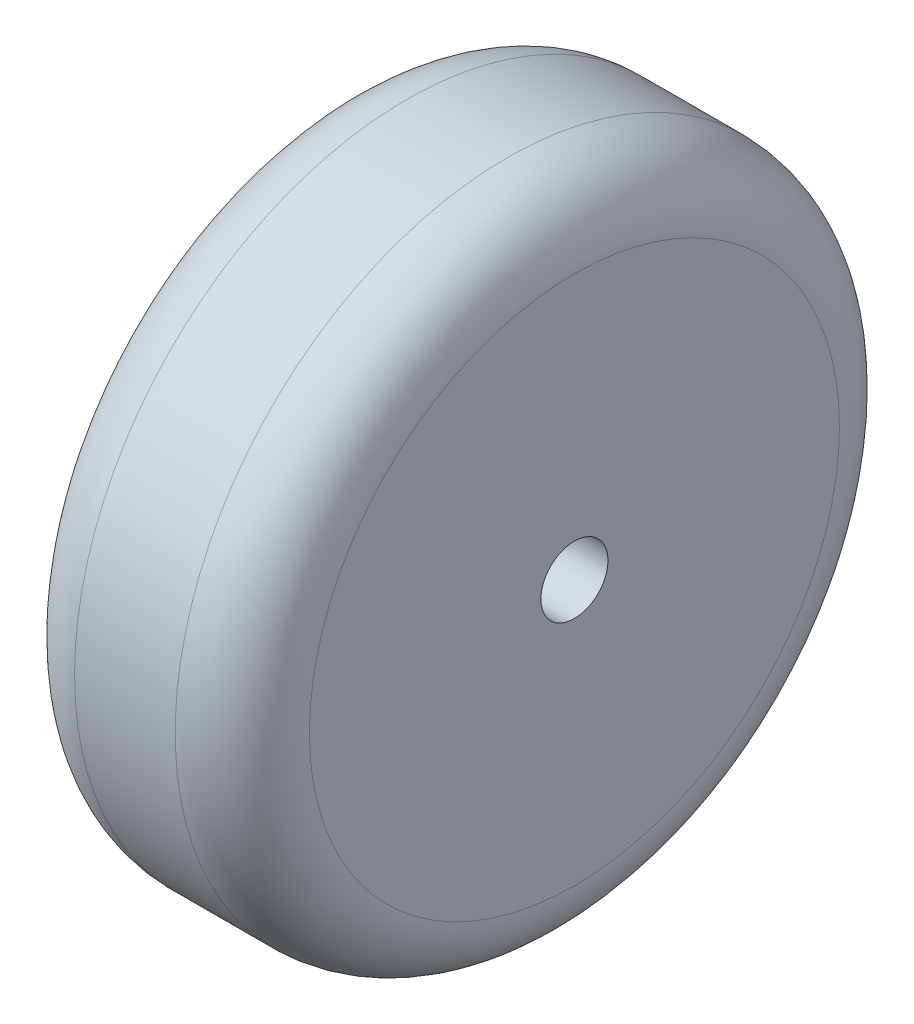
ISO-10303-21;
HEADER;
FILE_DESCRIPTION(('STEP AP214'),'2;1');
FILE_NAME('part.step','',(''),(''),'','','');
FILE_SCHEMA(('AUTOMOTIVE_DESIGN { 1 0 10303 214 1 1 1 1 }'));
ENDSEC;
DATA;
#1=APPLICATION_CONTEXT('core data for automotive mechanical design processes');
#2=APPLICATION_PROTOCOL_DEFINITION('international standard','automotive_design',2000,#1);
#3=PRODUCT_CONTEXT('',#1,'mechanical');
#4=PRODUCT('Part','Part','',(#3));
#5=PRODUCT_RELATED_PRODUCT_CATEGORY('part','',(#4));
#6=PRODUCT_DEFINITION_FORMATION('','',#4);
#7=PRODUCT_DEFINITION_CONTEXT('part definition',#1,'design');
#8=PRODUCT_DEFINITION('design','',#6,#7);
#9=PRODUCT_DEFINITION_SHAPE('','',#8);
#10=(LENGTH_UNIT() NAMED_UNIT(*) SI_UNIT(.MILLI.,.METRE.));
#11=(NAMED_UNIT(*) PLANE_ANGLE_UNIT() SI_UNIT($,.RADIAN.));
#12=(NAMED_UNIT(*) SI_UNIT($,.STERADIAN.) SOLID_ANGLE_UNIT());
#13=UNCERTAINTY_MEASURE_WITH_UNIT(LENGTH_MEASURE(1.E-05),#10,'distance_accuracy_value','');
#14=(GEOMETRIC_REPRESENTATION_CONTEXT(3) GLOBAL_UNCERTAINTY_ASSIGNED_CONTEXT((#13)) GLOBAL_UNIT_ASSIGNED_CONTEXT((#10,
#11,#12)) REPRESENTATION_CONTEXT('',''));
#15=CARTESIAN_POINT('',(0.,0.,0.));
#16=DIRECTION('',(0.,0.,1.));
#17=DIRECTION('',(1.,0.,0.));
#18=AXIS2_PLACEMENT_3D('',#15,#16,#17);
#19=CARTESIAN_POINT('',(-35.,56.75,0.));
#20=DIRECTION('',(-1.,0.,0.));
#21=DIRECTION('',(0.,0.,1.));
#22=AXIS2_PLACEMENT_3D('',#19,#20,#21);
#23=PLANE('',#22);
#24=CARTESIAN_POINT('',(-35.,0.,0.));
#25=DIRECTION('',(-1.,0.,0.));
#26=DIRECTION('',(0.,0.,1.));
#27=AXIS2_PLACEMENT_3D('',#24,#25,#26);
#28=CIRCLE('',#27,79.);
#29=CARTESIAN_POINT('',(-35.,0.,79.));
#30=VERTEX_POINT('',#29);
#31=EDGE_CURVE('E11',#30,#30,#28,.T.);
#32=ORIENTED_EDGE('',*,*,#31,.T.);
#33=EDGE_LOOP('',(#32));
#34=FACE_BOUND('',#33,.T.);
#35=DIRECTION('',(0.,0.,-1.));
#36=VECTOR('',#35,1.);
#37=CARTESIAN_POINT('',(-35.,66.5293065586338,-5.));
#38=LINE('',#37,#36);
#39=CARTESIAN_POINT('',(-35.,66.5293065586338,5.));
#40=VERTEX_POINT('',#39);
#41=CARTESIAN_POINT('',(-35.,66.5293065586338,-5.));
#42=VERTEX_POINT('',#41);
#43=EDGE_CURVE('E102',#40,#42,#38,.T.);
#44=ORIENTED_EDGE('',*,*,#43,.F.);
#45=DIRECTION('',(0.,1.,0.));
#46=VECTOR('',#45,1.);
#47=CARTESIAN_POINT('',(-35.,66.5293065586338,5.));
#48=LINE('',#47,#46);
#49=CARTESIAN_POINT('',(-35.,56.5293065586338,5.));
#50=VERTEX_POINT('',#49);
#51=EDGE_CURVE('E90',#50,#40,#48,.T.);
#52=ORIENTED_EDGE('',*,*,#51,.F.);
#53=CARTESIAN_POINT('',(-35.,0.,0.));
#54=DIRECTION('',(1.,0.,0.));
#55=DIRECTION('',(0.,0.,-1.));
#56=AXIS2_PLACEMENT_3D('',#53,#54,#55);
#57=CIRCLE('',#56,56.75);
#58=CARTESIAN_POINT('',(-35.,56.5293065586338,-5.));
#59=VERTEX_POINT('',#58);
#60=EDGE_CURVE('E111',#50,#59,#57,.T.);
#61=ORIENTED_EDGE('',*,*,#60,.T.);
#62=DIRECTION('',(0.,-1.,0.));
#63=VECTOR('',#62,1.);
#64=CARTESIAN_POINT('',(-35.,66.5293065586338,-5.));
#65=LINE('',#64,#63);
#66=EDGE_CURVE('E71',#42,#59,#65,.T.);
#67=ORIENTED_EDGE('',*,*,#66,.F.);
#68=EDGE_LOOP('',(#44,#52,#61,#67));
#69=FACE_BOUND('',#68,.T.);
#70=ADVANCED_FACE('F34',(#34,#69),#23,.T.);
#71=CARTESIAN_POINT('',(45.,0.,0.));
#72=DIRECTION('',(1.,0.,0.));
#73=DIRECTION('',(0.,0.,-1.));
#74=AXIS2_PLACEMENT_3D('',#71,#72,#73);
#75=CYLINDRICAL_SURFACE('',#74,9.99999999999999);
#76=CARTESIAN_POINT('',(35.,0.,0.));
#77=DIRECTION('',(1.,0.,0.));
#78=DIRECTION('',(0.,0.,-1.));
#79=AXIS2_PLACEMENT_3D('',#76,#77,#78);
#80=CIRCLE('',#79,9.99999999999999);
#81=CARTESIAN_POINT('',(35.,0.,-9.99999999999999));
#82=VERTEX_POINT('',#81);
#83=EDGE_CURVE('E108',#82,#82,#80,.T.);
#84=ORIENTED_EDGE('',*,*,#83,.T.);
#85=EDGE_LOOP('',(#84));
#86=FACE_BOUND('',#85,.T.);
#87=CARTESIAN_POINT('',(15.51,0.,0.));
#88=DIRECTION('',(1.,0.,0.));
#89=DIRECTION('',(0.,0.,-1.));
#90=AXIS2_PLACEMENT_3D('',#87,#88,#89);
#91=CIRCLE('',#90,10.);
#92=CARTESIAN_POINT('',(15.51,0.,-10.));
#93=VERTEX_POINT('',#92);
#94=EDGE_CURVE('E129',#93,#93,#91,.T.);
#95=ORIENTED_EDGE('',*,*,#94,.F.);
#96=EDGE_LOOP('',(#95));
#97=FACE_BOUND('',#96,.T.);
#98=ADVANCED_FACE('F154',(#86,#97),#75,.F.);
#99=CARTESIAN_POINT('',(15.51,10.,0.));
#100=DIRECTION('',(-1.,0.,0.));
#101=DIRECTION('',(0.,0.,1.));
#102=AXIS2_PLACEMENT_3D('',#99,#100,#101);
#103=PLANE('',#102);
#104=ORIENTED_EDGE('',*,*,#94,.T.);
#105=EDGE_LOOP('',(#104));
#106=FACE_BOUND('',#105,.T.);
#107=CARTESIAN_POINT('',(15.51,0.,0.));
#108=DIRECTION('',(1.,0.,0.));
#109=DIRECTION('',(0.,0.,-1.));
#110=AXIS2_PLACEMENT_3D('',#107,#108,#109);
#111=CIRCLE('',#110,17.5);
#112=CARTESIAN_POINT('',(15.51,0.,-17.5));
#113=VERTEX_POINT('',#112);
#114=EDGE_CURVE('E126',#113,#113,#111,.T.);
#115=ORIENTED_EDGE('',*,*,#114,.F.);
#116=EDGE_LOOP('',(#115));
#117=FACE_BOUND('',#116,.T.);
#118=ADVANCED_FACE('F157',(#106,#117),#103,.T.);
#119=CARTESIAN_POINT('',(45.,0.,0.));
#120=DIRECTION('',(1.,0.,0.));
#121=DIRECTION('',(0.,0.,-1.));
#122=AXIS2_PLACEMENT_3D('',#119,#120,#121);
#123=CYLINDRICAL_SURFACE('',#122,17.5);
#124=ORIENTED_EDGE('',*,*,#114,.T.);
#125=EDGE_LOOP('',(#124));
#126=FACE_BOUND('',#125,.T.);
#127=CARTESIAN_POINT('',(4.51000000000002,0.,0.));
#128=DIRECTION('',(1.,0.,0.));
#129=DIRECTION('',(0.,0.,-1.));
#130=AXIS2_PLACEMENT_3D('',#127,#128,#129);
#131=CIRCLE('',#130,17.5);
#132=CARTESIAN_POINT('',(4.51000000000002,0.,-17.5));
#133=VERTEX_POINT('',#132);
#134=EDGE_CURVE('E123',#133,#133,#131,.T.);
#135=ORIENTED_EDGE('',*,*,#134,.F.);
#136=EDGE_LOOP('',(#135));
#137=FACE_BOUND('',#136,.T.);
#138=ADVANCED_FACE('F163',(#126,#137),#123,.F.);
#139=CARTESIAN_POINT('',(4.51000000000002,17.5,0.));
#140=DIRECTION('',(-1.,0.,0.));
#141=DIRECTION('',(0.,0.,1.));
#142=AXIS2_PLACEMENT_3D('',#139,#140,#141);
#143=PLANE('',#142);
#144=ORIENTED_EDGE('',*,*,#134,.T.);
#145=EDGE_LOOP('',(#144));
#146=FACE_BOUND('',#145,.T.);
#147=CARTESIAN_POINT('',(4.51000000000002,0.,0.));
#148=DIRECTION('',(1.,0.,0.));
#149=DIRECTION('',(0.,0.,-1.));
#150=AXIS2_PLACEMENT_3D('',#147,#148,#149);
#151=CIRCLE('',#150,32.5);
#152=CARTESIAN_POINT('',(4.51000000000002,0.,-32.5));
#153=VERTEX_POINT('',#152);
#154=EDGE_CURVE('E120',#153,#153,#151,.T.);
#155=ORIENTED_EDGE('',*,*,#154,.F.);
#156=EDGE_LOOP('',(#155));
#157=FACE_BOUND('',#156,.T.);
#158=ADVANCED_FACE('F169',(#146,#157),#143,.T.);
#159=CARTESIAN_POINT('',(45.,0.,0.));
#160=DIRECTION('',(1.,0.,0.));
#161=DIRECTION('',(0.,0.,-1.));
#162=AXIS2_PLACEMENT_3D('',#159,#160,#161);
#163=CYLINDRICAL_SURFACE('',#162,32.5);
#164=ORIENTED_EDGE('',*,*,#154,.T.);
#165=EDGE_LOOP('',(#164));
#166=FACE_BOUND('',#165,.T.);
#167=CARTESIAN_POINT('',(-28.39,0.,0.));
#168=DIRECTION('',(1.,0.,0.));
#169=DIRECTION('',(0.,0.,-1.));
#170=AXIS2_PLACEMENT_3D('',#167,#168,#169);
#171=CIRCLE('',#170,32.5);
#172=CARTESIAN_POINT('',(-28.39,0.,-32.5));
#173=VERTEX_POINT('',#172);
#174=EDGE_CURVE('E117',#173,#173,#171,.T.);
#175=ORIENTED_EDGE('',*,*,#174,.F.);
#176=EDGE_LOOP('',(#175));
#177=FACE_BOUND('',#176,.T.);
#178=ADVANCED_FACE('F175',(#166,#177),#163,.F.);
#179=CARTESIAN_POINT('',(-28.39,32.5,0.));
#180=DIRECTION('',(-1.,0.,0.));
#181=DIRECTION('',(0.,0.,1.));
#182=AXIS2_PLACEMENT_3D('',#179,#180,#181);
#183=PLANE('',#182);
#184=ORIENTED_EDGE('',*,*,#174,.T.);
#185=EDGE_LOOP('',(#184));
#186=FACE_BOUND('',#185,.T.);
#187=CARTESIAN_POINT('',(-28.39,0.,0.));
#188=DIRECTION('',(1.,0.,0.));
#189=DIRECTION('',(0.,0.,-1.));
#190=AXIS2_PLACEMENT_3D('',#187,#188,#189);
#191=CIRCLE('',#190,56.75);
#192=CARTESIAN_POINT('',(-28.39,0.,-56.75));
#193=VERTEX_POINT('',#192);
#194=EDGE_CURVE('E114',#193,#193,#191,.T.);
#195=ORIENTED_EDGE('',*,*,#194,.F.);
#196=EDGE_LOOP('',(#195));
#197=FACE_BOUND('',#196,.T.);
#198=ADVANCED_FACE('F181',(#186,#197),#183,.T.);
#199=CARTESIAN_POINT('',(45.,0.,0.));
#200=DIRECTION('',(1.,0.,0.));
#201=DIRECTION('',(0.,0.,-1.));
#202=AXIS2_PLACEMENT_3D('',#199,#200,#201);
#203=CYLINDRICAL_SURFACE('',#202,56.75);
#204=ORIENTED_EDGE('',*,*,#194,.T.);
#205=EDGE_LOOP('',(#204));
#206=FACE_BOUND('',#205,.T.);
#207=ORIENTED_EDGE('',*,*,#60,.F.);
#208=DIRECTION('',(1.,0.,0.));
#209=VECTOR('',#208,1.);
#210=CARTESIAN_POINT('',(-36.,56.5293065586338,5.));
#211=LINE('',#210,#209);
#212=CARTESIAN_POINT('',(-36.,56.5293065586338,5.));
#213=VERTEX_POINT('',#212);
#214=EDGE_CURVE('E93',#213,#50,#211,.T.);
#215=ORIENTED_EDGE('',*,*,#214,.F.);
#216=CARTESIAN_POINT('',(-36.,0.,0.));
#217=DIRECTION('',(1.,0.,0.));
#218=DIRECTION('',(0.,0.,1.));
#219=AXIS2_PLACEMENT_3D('',#216,#217,#218);
#220=CIRCLE('',#219,56.75);
#221=CARTESIAN_POINT('',(-36.,56.5293065586338,-5.));
#222=VERTEX_POINT('',#221);
#223=EDGE_CURVE('E83',#222,#213,#220,.T.);
#224=ORIENTED_EDGE('',*,*,#223,.F.);
#225=DIRECTION('',(1.,0.,0.));
#226=VECTOR('',#225,1.);
#227=CARTESIAN_POINT('',(-36.,56.5293065586338,-5.));
#228=LINE('',#227,#226);
#229=EDGE_CURVE('E97',#222,#59,#228,.T.);
#230=ORIENTED_EDGE('',*,*,#229,.T.);
#231=EDGE_LOOP('',(#207,#215,#224,#230));
#232=FACE_BOUND('',#231,.T.);
#233=ADVANCED_FACE('F187',(#206,#232),#203,.F.);
#234=CARTESIAN_POINT('',(45.,0.,0.));
#235=DIRECTION('',(1.,0.,0.));
#236=DIRECTION('',(0.,0.,-1.));
#237=AXIS2_PLACEMENT_3D('',#234,#235,#236);
#238=CYLINDRICAL_SURFACE('',#237,99.);
#239=CARTESIAN_POINT('',(15.,0.,0.));
#240=DIRECTION('',(1.,0.,0.));
#241=DIRECTION('',(0.,0.,-1.));
#242=AXIS2_PLACEMENT_3D('',#239,#240,#241);
#243=CIRCLE('',#242,99.);
#244=CARTESIAN_POINT('',(15.,0.,-99.));
#245=VERTEX_POINT('',#244);
#246=EDGE_CURVE('E42',#245,#245,#243,.F.);
#247=ORIENTED_EDGE('',*,*,#246,.T.);
#248=EDGE_LOOP('',(#247));
#249=FACE_BOUND('',#248,.T.);
#250=CARTESIAN_POINT('',(-15.,0.,0.));
#251=DIRECTION('',(-1.,0.,0.));
#252=DIRECTION('',(0.,0.,1.));
#253=AXIS2_PLACEMENT_3D('',#250,#251,#252);
#254=CIRCLE('',#253,99.);
#255=CARTESIAN_POINT('',(-15.,0.,99.));
#256=VERTEX_POINT('',#255);
#257=EDGE_CURVE('E135',#256,#256,#254,.F.);
#258=ORIENTED_EDGE('',*,*,#257,.T.);
#259=EDGE_LOOP('',(#258));
#260=FACE_BOUND('',#259,.T.);
#261=ADVANCED_FACE('F140',(#249,#260),#238,.T.);
#262=CARTESIAN_POINT('',(35.,99.,0.));
#263=DIRECTION('',(1.,0.,0.));
#264=DIRECTION('',(0.,0.,-1.));
#265=AXIS2_PLACEMENT_3D('',#262,#263,#264);
#266=PLANE('',#265);
#267=CARTESIAN_POINT('',(35.,0.,0.));
#268=DIRECTION('',(1.,0.,0.));
#269=DIRECTION('',(0.,0.,-1.));
#270=AXIS2_PLACEMENT_3D('',#267,#268,#269);
#271=CIRCLE('',#270,79.);
#272=CARTESIAN_POINT('',(35.,0.,-79.));
#273=VERTEX_POINT('',#272);
#274=EDGE_CURVE('E132',#273,#273,#271,.T.);
#275=ORIENTED_EDGE('',*,*,#274,.T.);
#276=EDGE_LOOP('',(#275));
#277=FACE_BOUND('',#276,.T.);
#278=ORIENTED_EDGE('',*,*,#83,.F.);
#279=EDGE_LOOP('',(#278));
#280=FACE_BOUND('',#279,.T.);
#281=ADVANCED_FACE('F146',(#277,#280),#266,.T.);
#282=CARTESIAN_POINT('',(15.,0.,0.));
#283=DIRECTION('',(1.,0.,0.));
#284=DIRECTION('',(0.,0.,-1.));
#285=AXIS2_PLACEMENT_3D('',#282,#283,#284);
#286=TOROIDAL_SURFACE('',#285,79.,20.);
#287=ORIENTED_EDGE('',*,*,#246,.F.);
#288=EDGE_LOOP('',(#287));
#289=FACE_BOUND('',#288,.T.);
#290=ORIENTED_EDGE('',*,*,#274,.F.);
#291=EDGE_LOOP('',(#290));
#292=FACE_BOUND('',#291,.T.);
#293=ADVANCED_FACE('F143',(#289,#292),#286,.T.);
#294=CARTESIAN_POINT('',(-15.,0.,0.));
#295=DIRECTION('',(-1.,0.,0.));
#296=DIRECTION('',(0.,0.,1.));
#297=AXIS2_PLACEMENT_3D('',#294,#295,#296);
#298=TOROIDAL_SURFACE('',#297,79.,20.);
#299=ORIENTED_EDGE('',*,*,#31,.F.);
#300=EDGE_LOOP('',(#299));
#301=FACE_BOUND('',#300,.T.);
#302=ORIENTED_EDGE('',*,*,#257,.F.);
#303=EDGE_LOOP('',(#302));
#304=FACE_BOUND('',#303,.T.);
#305=ADVANCED_FACE('F36',(#301,#304),#298,.T.);
#306=CARTESIAN_POINT('',(-36.,66.5293065586338,5.));
#307=DIRECTION('',(0.,0.,-1.));
#308=DIRECTION('',(-1.,0.,0.));
#309=AXIS2_PLACEMENT_3D('',#306,#307,#308);
#310=PLANE('',#309);
#311=ORIENTED_EDGE('',*,*,#51,.T.);
#312=DIRECTION('',(1.,0.,0.));
#313=VECTOR('',#312,1.);
#314=CARTESIAN_POINT('',(-36.,66.5293065586338,5.));
#315=LINE('',#314,#313);
#316=CARTESIAN_POINT('',(-36.,66.5293065586338,5.));
#317=VERTEX_POINT('',#316);
#318=EDGE_CURVE('E87',#317,#40,#315,.T.);
#319=ORIENTED_EDGE('',*,*,#318,.F.);
#320=DIRECTION('',(0.,1.,0.));
#321=VECTOR('',#320,1.);
#322=CARTESIAN_POINT('',(-36.,66.5293065586338,5.));
#323=LINE('',#322,#321);
#324=EDGE_CURVE('E78',#213,#317,#323,.T.);
#325=ORIENTED_EDGE('',*,*,#324,.F.);
#326=ORIENTED_EDGE('',*,*,#214,.T.);
#327=EDGE_LOOP('',(#311,#319,#325,#326));
#328=FACE_BOUND('',#327,.T.);
#329=ADVANCED_FACE('F88',(#328),#310,.F.);
#330=CARTESIAN_POINT('',(-36.,66.5293065586338,-5.));
#331=DIRECTION('',(0.,-1.,0.));
#332=DIRECTION('',(0.,0.,-1.));
#333=AXIS2_PLACEMENT_3D('',#330,#331,#332);
#334=PLANE('',#333);
#335=ORIENTED_EDGE('',*,*,#43,.T.);
#336=DIRECTION('',(1.,0.,0.));
#337=VECTOR('',#336,1.);
#338=CARTESIAN_POINT('',(-36.,66.5293065586338,-5.));
#339=LINE('',#338,#337);
#340=CARTESIAN_POINT('',(-36.,66.5293065586338,-5.));
#341=VERTEX_POINT('',#340);
#342=EDGE_CURVE('E49',#341,#42,#339,.T.);
#343=ORIENTED_EDGE('',*,*,#342,.F.);
#344=DIRECTION('',(0.,0.,-1.));
#345=VECTOR('',#344,1.);
#346=CARTESIAN_POINT('',(-36.,66.5293065586338,-5.));
#347=LINE('',#346,#345);
#348=EDGE_CURVE('E81',#317,#341,#347,.T.);
#349=ORIENTED_EDGE('',*,*,#348,.F.);
#350=ORIENTED_EDGE('',*,*,#318,.T.);
#351=EDGE_LOOP('',(#335,#343,#349,#350));
#352=FACE_BOUND('',#351,.T.);
#353=ADVANCED_FACE('F95',(#352),#334,.F.);
#354=CARTESIAN_POINT('',(-36.,66.5293065586338,-5.));
#355=DIRECTION('',(0.,0.,1.));
#356=DIRECTION('',(0.,-1.,0.));
#357=AXIS2_PLACEMENT_3D('',#354,#355,#356);
#358=PLANE('',#357);
#359=ORIENTED_EDGE('',*,*,#66,.T.);
#360=ORIENTED_EDGE('',*,*,#229,.F.);
#361=DIRECTION('',(0.,-1.,0.));
#362=VECTOR('',#361,1.);
#363=CARTESIAN_POINT('',(-36.,66.5293065586338,-5.));
#364=LINE('',#363,#362);
#365=EDGE_CURVE('E57',#341,#222,#364,.T.);
#366=ORIENTED_EDGE('',*,*,#365,.F.);
#367=ORIENTED_EDGE('',*,*,#342,.T.);
#368=EDGE_LOOP('',(#359,#360,#366,#367));
#369=FACE_BOUND('',#368,.T.);
#370=ADVANCED_FACE('F208',(#369),#358,.F.);
#371=CARTESIAN_POINT('',(-36.,0.,0.));
#372=DIRECTION('',(-1.,0.,0.));
#373=DIRECTION('',(0.,0.,1.));
#374=AXIS2_PLACEMENT_3D('',#371,#372,#373);
#375=PLANE('',#374);
#376=ORIENTED_EDGE('',*,*,#223,.T.);
#377=ORIENTED_EDGE('',*,*,#324,.T.);
#378=ORIENTED_EDGE('',*,*,#348,.T.);
#379=ORIENTED_EDGE('',*,*,#365,.T.);
#380=EDGE_LOOP('',(#376,#377,#378,#379));
#381=FACE_BOUND('',#380,.T.);
#382=ADVANCED_FACE('F79',(#381),#375,.T.);
#383=CLOSED_SHELL('',(#70,#98,#118,#138,#158,#178,#198,#233,#261,#281,#293,#305,#329,#353,#370,#382));
#384=MANIFOLD_SOLID_BREP('B2',#383);
#385=ADVANCED_BREP_SHAPE_REPRESENTATION('',(#18,#384),#14);
#386=SHAPE_DEFINITION_REPRESENTATION(#9,#385);
ENDSEC;
END-ISO-10303-21;
